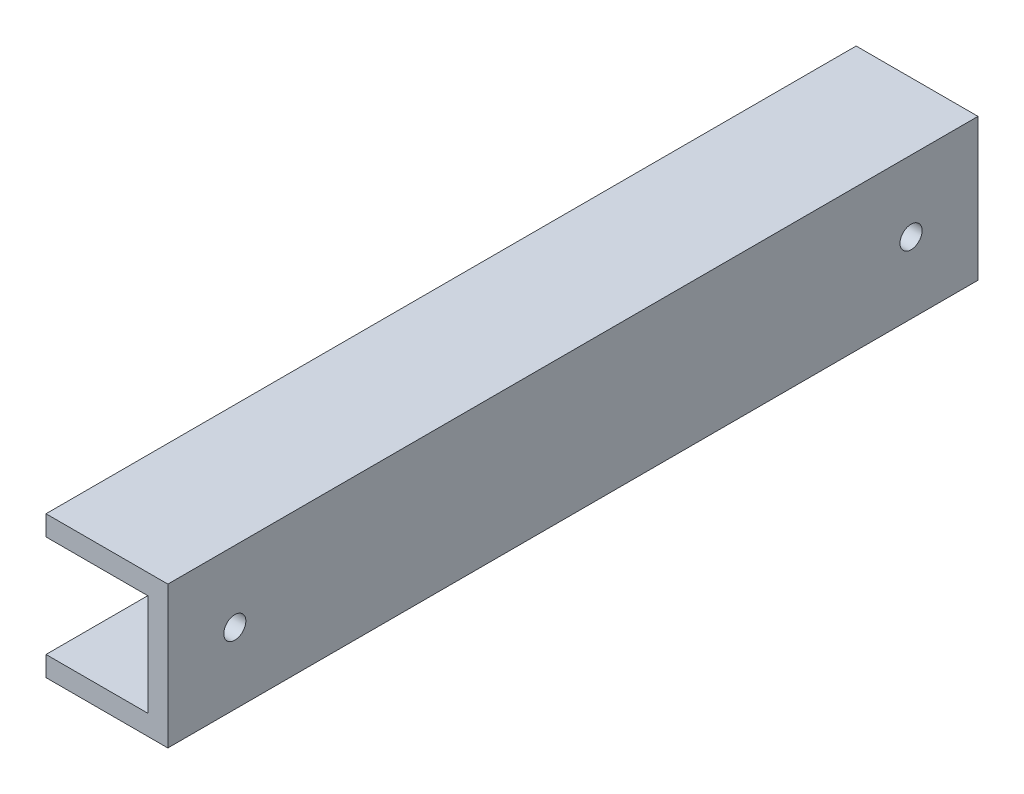
ISO-10303-21;
HEADER;
FILE_DESCRIPTION(('STEP AP214'),'2;1');
FILE_NAME('part.step','',(''),(''),'','','');
FILE_SCHEMA(('AUTOMOTIVE_DESIGN { 1 0 10303 214 1 1 1 1 }'));
ENDSEC;
DATA;
#1=APPLICATION_CONTEXT('core data for automotive mechanical design processes');
#2=APPLICATION_PROTOCOL_DEFINITION('international standard','automotive_design',2000,#1);
#3=PRODUCT_CONTEXT('',#1,'mechanical');
#4=PRODUCT('Part','Part','',(#3));
#5=PRODUCT_RELATED_PRODUCT_CATEGORY('part','',(#4));
#6=PRODUCT_DEFINITION_FORMATION('','',#4);
#7=PRODUCT_DEFINITION_CONTEXT('part definition',#1,'design');
#8=PRODUCT_DEFINITION('design','',#6,#7);
#9=PRODUCT_DEFINITION_SHAPE('','',#8);
#10=(LENGTH_UNIT() NAMED_UNIT(*) SI_UNIT(.MILLI.,.METRE.));
#11=(NAMED_UNIT(*) PLANE_ANGLE_UNIT() SI_UNIT($,.RADIAN.));
#12=(NAMED_UNIT(*) SI_UNIT($,.STERADIAN.) SOLID_ANGLE_UNIT());
#13=UNCERTAINTY_MEASURE_WITH_UNIT(LENGTH_MEASURE(1.E-05),#10,'distance_accuracy_value','');
#14=(GEOMETRIC_REPRESENTATION_CONTEXT(3) GLOBAL_UNCERTAINTY_ASSIGNED_CONTEXT((#13)) GLOBAL_UNIT_ASSIGNED_CONTEXT((#10,
#11,#12)) REPRESENTATION_CONTEXT('',''));
#15=CARTESIAN_POINT('',(0.,0.,0.));
#16=DIRECTION('',(0.,0.,1.));
#17=DIRECTION('',(1.,0.,0.));
#18=AXIS2_PLACEMENT_3D('',#15,#16,#17);
#19=CARTESIAN_POINT('',(5.2,15.2,25.));
#20=DIRECTION('',(0.,0.,1.));
#21=DIRECTION('',(0.,-1.,0.));
#22=AXIS2_PLACEMENT_3D('',#19,#20,#21);
#23=PLANE('',#22);
#24=DIRECTION('',(1.,0.,0.));
#25=VECTOR('',#24,1.);
#26=CARTESIAN_POINT('',(5.2,15.2,25.));
#27=LINE('',#26,#25);
#28=CARTESIAN_POINT('',(5.2,15.2,25.));
#29=VERTEX_POINT('',#28);
#30=CARTESIAN_POINT('',(11.2,15.2,25.));
#31=VERTEX_POINT('',#30);
#32=EDGE_CURVE('E237',#29,#31,#27,.T.);
#33=ORIENTED_EDGE('',*,*,#32,.T.);
#34=DIRECTION('',(0.,-1.,0.));
#35=VECTOR('',#34,1.);
#36=CARTESIAN_POINT('',(11.2,15.2,25.));
#37=LINE('',#36,#35);
#38=CARTESIAN_POINT('',(11.2,10.1,25.));
#39=VERTEX_POINT('',#38);
#40=EDGE_CURVE('E71',#31,#39,#37,.T.);
#41=ORIENTED_EDGE('',*,*,#40,.T.);
#42=DIRECTION('',(-1.,0.,0.));
#43=VECTOR('',#42,1.);
#44=CARTESIAN_POINT('',(8.2,10.1,25.));
#45=LINE('',#44,#43);
#46=CARTESIAN_POINT('',(5.2,10.1,25.));
#47=VERTEX_POINT('',#46);
#48=EDGE_CURVE('E352',#39,#47,#45,.T.);
#49=ORIENTED_EDGE('',*,*,#48,.T.);
#50=DIRECTION('',(0.,-1.,0.));
#51=VECTOR('',#50,1.);
#52=CARTESIAN_POINT('',(5.2,15.2,25.));
#53=LINE('',#52,#51);
#54=EDGE_CURVE('E223',#29,#47,#53,.T.);
#55=ORIENTED_EDGE('',*,*,#54,.F.);
#56=EDGE_LOOP('',(#33,#41,#49,#55));
#57=FACE_BOUND('',#56,.T.);
#58=ADVANCED_FACE('F62',(#57),#23,.F.);
#59=CARTESIAN_POINT('',(5.2,15.2,96.));
#60=DIRECTION('',(0.,0.,-1.));
#61=DIRECTION('',(-1.,0.,0.));
#62=AXIS2_PLACEMENT_3D('',#59,#60,#61);
#63=PLANE('',#62);
#64=DIRECTION('',(1.,0.,0.));
#65=VECTOR('',#64,1.);
#66=CARTESIAN_POINT('',(5.2,0.,96.));
#67=LINE('',#66,#65);
#68=CARTESIAN_POINT('',(5.2,0.,96.));
#69=VERTEX_POINT('',#68);
#70=CARTESIAN_POINT('',(11.2,0.,96.));
#71=VERTEX_POINT('',#70);
#72=EDGE_CURVE('E224',#69,#71,#67,.T.);
#73=ORIENTED_EDGE('',*,*,#72,.T.);
#74=DIRECTION('',(0.,1.,0.));
#75=VECTOR('',#74,1.);
#76=CARTESIAN_POINT('',(11.2,15.2,96.));
#77=LINE('',#76,#75);
#78=CARTESIAN_POINT('',(11.2,5.1,96.));
#79=VERTEX_POINT('',#78);
#80=EDGE_CURVE('E334',#71,#79,#77,.T.);
#81=ORIENTED_EDGE('',*,*,#80,.T.);
#82=DIRECTION('',(-1.,0.,0.));
#83=VECTOR('',#82,1.);
#84=CARTESIAN_POINT('',(8.2,5.1,96.));
#85=LINE('',#84,#83);
#86=CARTESIAN_POINT('',(5.2,5.1,96.));
#87=VERTEX_POINT('',#86);
#88=EDGE_CURVE('E209',#79,#87,#85,.T.);
#89=ORIENTED_EDGE('',*,*,#88,.T.);
#90=DIRECTION('',(0.,1.,0.));
#91=VECTOR('',#90,1.);
#92=CARTESIAN_POINT('',(5.2,15.2,96.));
#93=LINE('',#92,#91);
#94=EDGE_CURVE('E218',#69,#87,#93,.T.);
#95=ORIENTED_EDGE('',*,*,#94,.F.);
#96=EDGE_LOOP('',(#73,#81,#89,#95));
#97=FACE_BOUND('',#96,.T.);
#98=ADVANCED_FACE('F424',(#97),#63,.F.);
#99=CARTESIAN_POINT('',(5.2,0.,0.));
#100=DIRECTION('',(-1.,0.,0.));
#101=DIRECTION('',(0.,0.,1.));
#102=AXIS2_PLACEMENT_3D('',#99,#100,#101);
#103=PLANE('',#102);
#104=DIRECTION('',(0.,0.,-1.));
#105=VECTOR('',#104,1.);
#106=CARTESIAN_POINT('',(5.2,10.1,25.));
#107=LINE('',#106,#105);
#108=CARTESIAN_POINT('',(5.2,10.1,96.));
#109=VERTEX_POINT('',#108);
#110=EDGE_CURVE('E219',#109,#47,#107,.T.);
#111=ORIENTED_EDGE('',*,*,#110,.F.);
#112=CARTESIAN_POINT('',(5.2,15.2,96.));
#113=VERTEX_POINT('',#112);
#114=EDGE_CURVE('E361',#109,#113,#93,.T.);
#115=ORIENTED_EDGE('',*,*,#114,.T.);
#116=DIRECTION('',(0.,0.,-1.));
#117=VECTOR('',#116,1.);
#118=CARTESIAN_POINT('',(5.2,15.2,25.));
#119=LINE('',#118,#117);
#120=EDGE_CURVE('E234',#113,#29,#119,.T.);
#121=ORIENTED_EDGE('',*,*,#120,.T.);
#122=ORIENTED_EDGE('',*,*,#54,.T.);
#123=EDGE_LOOP('',(#111,#115,#121,#122));
#124=FACE_BOUND('',#123,.T.);
#125=ADVANCED_FACE('F429',(#124),#103,.T.);
#126=CARTESIAN_POINT('',(0.,0.,121.));
#127=DIRECTION('',(0.,1.,0.));
#128=DIRECTION('',(0.,0.,1.));
#129=AXIS2_PLACEMENT_3D('',#126,#127,#128);
#130=PLANE('',#129);
#131=DIRECTION('',(0.,0.,-1.));
#132=VECTOR('',#131,1.);
#133=CARTESIAN_POINT('',(15.2,0.,121.));
#134=LINE('',#133,#132);
#135=CARTESIAN_POINT('',(15.2,0.,121.));
#136=VERTEX_POINT('',#135);
#137=CARTESIAN_POINT('',(15.2,0.,100.));
#138=VERTEX_POINT('',#137);
#139=EDGE_CURVE('E285',#136,#138,#134,.T.);
#140=ORIENTED_EDGE('',*,*,#139,.T.);
#141=DIRECTION('',(-0.707106781186551,0.,-0.707106781186544));
#142=VECTOR('',#141,1.);
#143=CARTESIAN_POINT('',(18.0999999999999,0.,102.9));
#144=LINE('',#143,#142);
#145=EDGE_CURVE('E344',#138,#71,#144,.T.);
#146=ORIENTED_EDGE('',*,*,#145,.T.);
#147=ORIENTED_EDGE('',*,*,#72,.F.);
#148=DIRECTION('',(0.,0.,1.));
#149=VECTOR('',#148,1.);
#150=CARTESIAN_POINT('',(5.2,0.,25.));
#151=LINE('',#150,#149);
#152=CARTESIAN_POINT('',(5.2,0.,25.));
#153=VERTEX_POINT('',#152);
#154=EDGE_CURVE('E227',#153,#69,#151,.T.);
#155=ORIENTED_EDGE('',*,*,#154,.F.);
#156=DIRECTION('',(1.,0.,0.));
#157=VECTOR('',#156,1.);
#158=CARTESIAN_POINT('',(5.2,0.,25.));
#159=LINE('',#158,#157);
#160=CARTESIAN_POINT('',(11.2,0.,25.));
#161=VERTEX_POINT('',#160);
#162=EDGE_CURVE('E222',#153,#161,#159,.T.);
#163=ORIENTED_EDGE('',*,*,#162,.T.);
#164=DIRECTION('',(0.707106781186551,0.,-0.707106781186544));
#165=VECTOR('',#164,1.);
#166=CARTESIAN_POINT('',(-42.4000000000001,0.,78.5999999999996));
#167=LINE('',#166,#165);
#168=CARTESIAN_POINT('',(15.2,0.,21.));
#169=VERTEX_POINT('',#168);
#170=EDGE_CURVE('E78',#161,#169,#167,.T.);
#171=ORIENTED_EDGE('',*,*,#170,.T.);
#172=CARTESIAN_POINT('',(15.2,0.,0.));
#173=VERTEX_POINT('',#172);
#174=EDGE_CURVE('E284',#169,#173,#134,.T.);
#175=ORIENTED_EDGE('',*,*,#174,.T.);
#176=DIRECTION('',(1.,0.,0.));
#177=VECTOR('',#176,1.);
#178=CARTESIAN_POINT('',(0.,0.,0.));
#179=LINE('',#178,#177);
#180=CARTESIAN_POINT('',(0.,0.,0.));
#181=VERTEX_POINT('',#180);
#182=EDGE_CURVE('E260',#181,#173,#179,.T.);
#183=ORIENTED_EDGE('',*,*,#182,.F.);
#184=DIRECTION('',(0.,0.,-1.));
#185=VECTOR('',#184,1.);
#186=CARTESIAN_POINT('',(0.,0.,121.));
#187=LINE('',#186,#185);
#188=CARTESIAN_POINT('',(0.,0.,121.));
#189=VERTEX_POINT('',#188);
#190=EDGE_CURVE('E288',#189,#181,#187,.T.);
#191=ORIENTED_EDGE('',*,*,#190,.F.);
#192=DIRECTION('',(1.,0.,0.));
#193=VECTOR('',#192,1.);
#194=CARTESIAN_POINT('',(0.,0.,121.));
#195=LINE('',#194,#193);
#196=EDGE_CURVE('E261',#189,#136,#195,.T.);
#197=ORIENTED_EDGE('',*,*,#196,.T.);
#198=EDGE_LOOP('',(#140,#146,#147,#155,#163,#171,#175,#183,#191,#197));
#199=FACE_BOUND('',#198,.T.);
#200=ADVANCED_FACE('F397',(#199),#130,.T.);
#201=CARTESIAN_POINT('',(15.2,0.,121.));
#202=DIRECTION('',(-1.,0.,0.));
#203=DIRECTION('',(0.,0.,1.));
#204=AXIS2_PLACEMENT_3D('',#201,#202,#203);
#205=PLANE('',#204);
#206=CARTESIAN_POINT('',(15.2,7.6,111.));
#207=DIRECTION('',(-1.,0.,0.));
#208=DIRECTION('',(0.,0.,1.));
#209=AXIS2_PLACEMENT_3D('',#206,#207,#208);
#210=CIRCLE('',#209,1.64999999999999);
#211=CARTESIAN_POINT('',(15.2,7.6,112.65));
#212=VERTEX_POINT('',#211);
#213=EDGE_CURVE('E248',#212,#212,#210,.T.);
#214=ORIENTED_EDGE('',*,*,#213,.F.);
#215=EDGE_LOOP('',(#214));
#216=FACE_BOUND('',#215,.T.);
#217=DIRECTION('',(0.,0.,-1.));
#218=VECTOR('',#217,1.);
#219=CARTESIAN_POINT('',(15.2,15.2,121.));
#220=LINE('',#219,#218);
#221=CARTESIAN_POINT('',(15.2,15.2,121.));
#222=VERTEX_POINT('',#221);
#223=CARTESIAN_POINT('',(15.2,15.2,100.));
#224=VERTEX_POINT('',#223);
#225=EDGE_CURVE('E281',#222,#224,#220,.T.);
#226=ORIENTED_EDGE('',*,*,#225,.T.);
#227=DIRECTION('',(0.,-1.,0.));
#228=VECTOR('',#227,1.);
#229=CARTESIAN_POINT('',(15.2,0.,100.));
#230=LINE('',#229,#228);
#231=EDGE_CURVE('E341',#224,#138,#230,.T.);
#232=ORIENTED_EDGE('',*,*,#231,.T.);
#233=ORIENTED_EDGE('',*,*,#139,.F.);
#234=DIRECTION('',(0.,1.,0.));
#235=VECTOR('',#234,1.);
#236=CARTESIAN_POINT('',(15.2,0.,121.));
#237=LINE('',#236,#235);
#238=EDGE_CURVE('E263',#136,#222,#237,.T.);
#239=ORIENTED_EDGE('',*,*,#238,.T.);
#240=EDGE_LOOP('',(#226,#232,#233,#239));
#241=FACE_BOUND('',#240,.T.);
#242=ADVANCED_FACE('F395',(#216,#241),#205,.T.);
#243=CARTESIAN_POINT('',(0.,15.2,121.));
#244=DIRECTION('',(0.,-1.,0.));
#245=DIRECTION('',(0.,0.,-1.));
#246=AXIS2_PLACEMENT_3D('',#243,#244,#245);
#247=PLANE('',#246);
#248=DIRECTION('',(1.,0.,0.));
#249=VECTOR('',#248,1.);
#250=CARTESIAN_POINT('',(5.2,15.2,96.));
#251=LINE('',#250,#249);
#252=CARTESIAN_POINT('',(11.2,15.2,96.));
#253=VERTEX_POINT('',#252);
#254=EDGE_CURVE('E229',#113,#253,#251,.T.);
#255=ORIENTED_EDGE('',*,*,#254,.T.);
#256=DIRECTION('',(0.707106781186551,0.,0.707106781186544));
#257=VECTOR('',#256,1.);
#258=CARTESIAN_POINT('',(18.0999999999999,15.2,102.9));
#259=LINE('',#258,#257);
#260=EDGE_CURVE('E339',#253,#224,#259,.T.);
#261=ORIENTED_EDGE('',*,*,#260,.T.);
#262=ORIENTED_EDGE('',*,*,#225,.F.);
#263=DIRECTION('',(-1.,0.,0.));
#264=VECTOR('',#263,1.);
#265=CARTESIAN_POINT('',(0.,15.2,121.));
#266=LINE('',#265,#264);
#267=CARTESIAN_POINT('',(0.,15.2,121.));
#268=VERTEX_POINT('',#267);
#269=EDGE_CURVE('E267',#222,#268,#266,.T.);
#270=ORIENTED_EDGE('',*,*,#269,.T.);
#271=DIRECTION('',(0.,0.,-1.));
#272=VECTOR('',#271,1.);
#273=CARTESIAN_POINT('',(0.,15.2,121.));
#274=LINE('',#273,#272);
#275=CARTESIAN_POINT('',(0.,15.2,0.));
#276=VERTEX_POINT('',#275);
#277=EDGE_CURVE('E270',#268,#276,#274,.T.);
#278=ORIENTED_EDGE('',*,*,#277,.T.);
#279=DIRECTION('',(-1.,0.,0.));
#280=VECTOR('',#279,1.);
#281=CARTESIAN_POINT('',(0.,15.2,0.));
#282=LINE('',#281,#280);
#283=CARTESIAN_POINT('',(15.2,15.2,0.));
#284=VERTEX_POINT('',#283);
#285=EDGE_CURVE('E264',#284,#276,#282,.T.);
#286=ORIENTED_EDGE('',*,*,#285,.F.);
#287=CARTESIAN_POINT('',(15.2,15.2,21.));
#288=VERTEX_POINT('',#287);
#289=EDGE_CURVE('E280',#288,#284,#220,.T.);
#290=ORIENTED_EDGE('',*,*,#289,.F.);
#291=DIRECTION('',(-0.707106781186551,0.,0.707106781186544));
#292=VECTOR('',#291,1.);
#293=CARTESIAN_POINT('',(-42.4,15.2,78.5999999999996));
#294=LINE('',#293,#292);
#295=EDGE_CURVE('E337',#288,#31,#294,.T.);
#296=ORIENTED_EDGE('',*,*,#295,.T.);
#297=ORIENTED_EDGE('',*,*,#32,.F.);
#298=ORIENTED_EDGE('',*,*,#120,.F.);
#299=EDGE_LOOP('',(#255,#261,#262,#270,#278,#286,#290,#296,#297,#298));
#300=FACE_BOUND('',#299,.T.);
#301=ADVANCED_FACE('F384',(#300),#247,.T.);
#302=CARTESIAN_POINT('',(15.2,7.6,10.));
#303=DIRECTION('',(-1.,0.,0.));
#304=DIRECTION('',(0.,0.,1.));
#305=AXIS2_PLACEMENT_3D('',#302,#303,#304);
#306=CIRCLE('',#305,1.65);
#307=CARTESIAN_POINT('',(15.2,7.6,11.65));
#308=VERTEX_POINT('',#307);
#309=EDGE_CURVE('E256',#308,#308,#306,.T.);
#310=ORIENTED_EDGE('',*,*,#309,.F.);
#311=EDGE_LOOP('',(#310));
#312=FACE_BOUND('',#311,.T.);
#313=ORIENTED_EDGE('',*,*,#174,.F.);
#314=DIRECTION('',(0.,1.,0.));
#315=VECTOR('',#314,1.);
#316=CARTESIAN_POINT('',(15.2,1.3695185336659E-13,21.));
#317=LINE('',#316,#315);
#318=EDGE_CURVE('E12',#169,#288,#317,.T.);
#319=ORIENTED_EDGE('',*,*,#318,.T.);
#320=ORIENTED_EDGE('',*,*,#289,.T.);
#321=DIRECTION('',(0.,1.,0.));
#322=VECTOR('',#321,1.);
#323=CARTESIAN_POINT('',(15.2,0.,0.));
#324=LINE('',#323,#322);
#325=EDGE_CURVE('E273',#173,#284,#324,.T.);
#326=ORIENTED_EDGE('',*,*,#325,.F.);
#327=EDGE_LOOP('',(#313,#319,#320,#326));
#328=FACE_BOUND('',#327,.T.);
#329=ADVANCED_FACE('F417',(#312,#328),#205,.T.);
#330=CARTESIAN_POINT('',(0.,0.,121.));
#331=DIRECTION('',(0.,0.,1.));
#332=DIRECTION('',(1.,0.,0.));
#333=AXIS2_PLACEMENT_3D('',#330,#331,#332);
#334=PLANE('',#333);
#335=DIRECTION('',(-1.,0.,0.));
#336=VECTOR('',#335,1.);
#337=CARTESIAN_POINT('',(0.,18.2,121.));
#338=LINE('',#337,#336);
#339=CARTESIAN_POINT('',(18.2,18.2,121.));
#340=VERTEX_POINT('',#339);
#341=CARTESIAN_POINT('',(0.,18.2,121.));
#342=VERTEX_POINT('',#341);
#343=EDGE_CURVE('E296',#340,#342,#338,.T.);
#344=ORIENTED_EDGE('',*,*,#343,.T.);
#345=DIRECTION('',(0.,-1.,0.));
#346=VECTOR('',#345,1.);
#347=CARTESIAN_POINT('',(0.,0.,121.));
#348=LINE('',#347,#346);
#349=EDGE_CURVE('E244',#342,#268,#348,.T.);
#350=ORIENTED_EDGE('',*,*,#349,.T.);
#351=ORIENTED_EDGE('',*,*,#269,.F.);
#352=ORIENTED_EDGE('',*,*,#238,.F.);
#353=ORIENTED_EDGE('',*,*,#196,.F.);
#354=CARTESIAN_POINT('',(0.,-3.,121.));
#355=VERTEX_POINT('',#354);
#356=EDGE_CURVE('E249',#189,#355,#348,.T.);
#357=ORIENTED_EDGE('',*,*,#356,.T.);
#358=DIRECTION('',(1.,0.,0.));
#359=VECTOR('',#358,1.);
#360=CARTESIAN_POINT('',(0.,-3.,121.));
#361=LINE('',#360,#359);
#362=CARTESIAN_POINT('',(18.2,-3.,121.));
#363=VERTEX_POINT('',#362);
#364=EDGE_CURVE('E291',#355,#363,#361,.T.);
#365=ORIENTED_EDGE('',*,*,#364,.T.);
#366=DIRECTION('',(0.,1.,0.));
#367=VECTOR('',#366,1.);
#368=CARTESIAN_POINT('',(18.2,0.,121.));
#369=LINE('',#368,#367);
#370=EDGE_CURVE('E293',#363,#340,#369,.T.);
#371=ORIENTED_EDGE('',*,*,#370,.T.);
#372=EDGE_LOOP('',(#344,#350,#351,#352,#353,#357,#365,#371));
#373=FACE_BOUND('',#372,.T.);
#374=ADVANCED_FACE('F404',(#373),#334,.T.);
#375=CARTESIAN_POINT('',(0.,0.,0.));
#376=DIRECTION('',(0.,0.,1.));
#377=DIRECTION('',(1.,0.,0.));
#378=AXIS2_PLACEMENT_3D('',#375,#376,#377);
#379=PLANE('',#378);
#380=DIRECTION('',(0.,-1.,0.));
#381=VECTOR('',#380,1.);
#382=CARTESIAN_POINT('',(0.,0.,0.));
#383=LINE('',#382,#381);
#384=CARTESIAN_POINT('',(0.,18.2,0.));
#385=VERTEX_POINT('',#384);
#386=EDGE_CURVE('E242',#385,#276,#383,.T.);
#387=ORIENTED_EDGE('',*,*,#386,.F.);
#388=DIRECTION('',(-1.,0.,0.));
#389=VECTOR('',#388,1.);
#390=CARTESIAN_POINT('',(0.,18.2,0.));
#391=LINE('',#390,#389);
#392=CARTESIAN_POINT('',(18.2,18.2,0.));
#393=VERTEX_POINT('',#392);
#394=EDGE_CURVE('E294',#393,#385,#391,.T.);
#395=ORIENTED_EDGE('',*,*,#394,.F.);
#396=DIRECTION('',(0.,1.,0.));
#397=VECTOR('',#396,1.);
#398=CARTESIAN_POINT('',(18.2,0.,0.));
#399=LINE('',#398,#397);
#400=CARTESIAN_POINT('',(18.2,-3.,0.));
#401=VERTEX_POINT('',#400);
#402=EDGE_CURVE('E301',#401,#393,#399,.T.);
#403=ORIENTED_EDGE('',*,*,#402,.F.);
#404=DIRECTION('',(1.,0.,0.));
#405=VECTOR('',#404,1.);
#406=CARTESIAN_POINT('',(0.,-3.,0.));
#407=LINE('',#406,#405);
#408=CARTESIAN_POINT('',(0.,-3.,0.));
#409=VERTEX_POINT('',#408);
#410=EDGE_CURVE('E290',#409,#401,#407,.T.);
#411=ORIENTED_EDGE('',*,*,#410,.F.);
#412=EDGE_CURVE('E241',#181,#409,#383,.T.);
#413=ORIENTED_EDGE('',*,*,#412,.F.);
#414=ORIENTED_EDGE('',*,*,#182,.T.);
#415=ORIENTED_EDGE('',*,*,#325,.T.);
#416=ORIENTED_EDGE('',*,*,#285,.T.);
#417=EDGE_LOOP('',(#387,#395,#403,#411,#413,#414,#415,#416));
#418=FACE_BOUND('',#417,.T.);
#419=ADVANCED_FACE('F412',(#418),#379,.F.);
#420=CARTESIAN_POINT('',(0.,-3.,121.));
#421=DIRECTION('',(0.,1.,0.));
#422=DIRECTION('',(0.,0.,1.));
#423=AXIS2_PLACEMENT_3D('',#420,#421,#422);
#424=PLANE('',#423);
#425=DIRECTION('',(0.,0.,1.));
#426=VECTOR('',#425,1.);
#427=CARTESIAN_POINT('',(0.,-3.,121.));
#428=LINE('',#427,#426);
#429=EDGE_CURVE('E250',#409,#355,#428,.T.);
#430=ORIENTED_EDGE('',*,*,#429,.F.);
#431=ORIENTED_EDGE('',*,*,#410,.T.);
#432=DIRECTION('',(0.,0.,-1.));
#433=VECTOR('',#432,1.);
#434=CARTESIAN_POINT('',(18.2,-3.,121.));
#435=LINE('',#434,#433);
#436=EDGE_CURVE('E307',#363,#401,#435,.T.);
#437=ORIENTED_EDGE('',*,*,#436,.F.);
#438=ORIENTED_EDGE('',*,*,#364,.F.);
#439=EDGE_LOOP('',(#430,#431,#437,#438));
#440=FACE_BOUND('',#439,.T.);
#441=ADVANCED_FACE('F467',(#440),#424,.F.);
#442=CARTESIAN_POINT('',(0.,18.2,121.));
#443=DIRECTION('',(0.,-1.,0.));
#444=DIRECTION('',(0.,0.,-1.));
#445=AXIS2_PLACEMENT_3D('',#442,#443,#444);
#446=PLANE('',#445);
#447=DIRECTION('',(0.,0.,-1.));
#448=VECTOR('',#447,1.);
#449=CARTESIAN_POINT('',(0.,18.2,121.));
#450=LINE('',#449,#448);
#451=EDGE_CURVE('E245',#342,#385,#450,.T.);
#452=ORIENTED_EDGE('',*,*,#451,.F.);
#453=ORIENTED_EDGE('',*,*,#343,.F.);
#454=DIRECTION('',(0.,0.,-1.));
#455=VECTOR('',#454,1.);
#456=CARTESIAN_POINT('',(18.2,18.2,121.));
#457=LINE('',#456,#455);
#458=EDGE_CURVE('E299',#340,#393,#457,.T.);
#459=ORIENTED_EDGE('',*,*,#458,.T.);
#460=ORIENTED_EDGE('',*,*,#394,.T.);
#461=EDGE_LOOP('',(#452,#453,#459,#460));
#462=FACE_BOUND('',#461,.T.);
#463=ADVANCED_FACE('F468',(#462),#446,.F.);
#464=CARTESIAN_POINT('',(18.2,0.,121.));
#465=DIRECTION('',(-1.,0.,0.));
#466=DIRECTION('',(0.,0.,1.));
#467=AXIS2_PLACEMENT_3D('',#464,#465,#466);
#468=PLANE('',#467);
#469=CARTESIAN_POINT('',(18.2,7.6,10.));
#470=DIRECTION('',(-1.,0.,0.));
#471=DIRECTION('',(0.,0.,1.));
#472=AXIS2_PLACEMENT_3D('',#469,#470,#471);
#473=CIRCLE('',#472,1.65);
#474=CARTESIAN_POINT('',(18.2,7.6,11.65));
#475=VERTEX_POINT('',#474);
#476=EDGE_CURVE('E257',#475,#475,#473,.T.);
#477=ORIENTED_EDGE('',*,*,#476,.T.);
#478=EDGE_LOOP('',(#477));
#479=FACE_BOUND('',#478,.T.);
#480=CARTESIAN_POINT('',(18.2,7.6,111.));
#481=DIRECTION('',(-1.,0.,0.));
#482=DIRECTION('',(0.,0.,1.));
#483=AXIS2_PLACEMENT_3D('',#480,#481,#482);
#484=CIRCLE('',#483,1.64999999999999);
#485=CARTESIAN_POINT('',(18.2,7.6,112.65));
#486=VERTEX_POINT('',#485);
#487=EDGE_CURVE('E253',#486,#486,#484,.T.);
#488=ORIENTED_EDGE('',*,*,#487,.T.);
#489=EDGE_LOOP('',(#488));
#490=FACE_BOUND('',#489,.T.);
#491=ORIENTED_EDGE('',*,*,#402,.T.);
#492=ORIENTED_EDGE('',*,*,#458,.F.);
#493=ORIENTED_EDGE('',*,*,#370,.F.);
#494=ORIENTED_EDGE('',*,*,#436,.T.);
#495=EDGE_LOOP('',(#491,#492,#493,#494));
#496=FACE_BOUND('',#495,.T.);
#497=ADVANCED_FACE('F454',(#479,#490,#496),#468,.F.);
#498=CARTESIAN_POINT('',(27.,7.6,111.));
#499=DIRECTION('',(-1.,0.,0.));
#500=DIRECTION('',(0.,0.,1.));
#501=AXIS2_PLACEMENT_3D('',#498,#499,#500);
#502=CYLINDRICAL_SURFACE('',#501,1.64999999999999);
#503=CARTESIAN_POINT('',(15.2,7.6,112.65));
#504=CARTESIAN_POINT('',(15.23125,7.6,112.65));
#505=CARTESIAN_POINT('',(15.2625,7.6,112.65));
#506=CARTESIAN_POINT('',(15.325,7.6,112.65));
#507=CARTESIAN_POINT('',(15.35625,7.6,112.65));
#508=CARTESIAN_POINT('',(15.41875,7.6,112.65));
#509=CARTESIAN_POINT('',(15.45,7.6,112.65));
#510=CARTESIAN_POINT('',(15.5125,7.6,112.65));
#511=CARTESIAN_POINT('',(15.54375,7.6,112.65));
#512=CARTESIAN_POINT('',(15.60625,7.6,112.65));
#513=CARTESIAN_POINT('',(15.6375,7.6,112.65));
#514=CARTESIAN_POINT('',(15.7,7.6,112.65));
#515=CARTESIAN_POINT('',(15.73125,7.6,112.65));
#516=CARTESIAN_POINT('',(15.79375,7.6,112.65));
#517=CARTESIAN_POINT('',(15.825,7.6,112.65));
#518=CARTESIAN_POINT('',(15.8875,7.6,112.65));
#519=CARTESIAN_POINT('',(15.91875,7.6,112.65));
#520=CARTESIAN_POINT('',(15.98125,7.6,112.65));
#521=CARTESIAN_POINT('',(16.0125,7.6,112.65));
#522=CARTESIAN_POINT('',(16.075,7.6,112.65));
#523=CARTESIAN_POINT('',(16.10625,7.6,112.65));
#524=CARTESIAN_POINT('',(16.16875,7.6,112.65));
#525=CARTESIAN_POINT('',(16.2,7.6,112.65));
#526=CARTESIAN_POINT('',(16.2625,7.6,112.65));
#527=CARTESIAN_POINT('',(16.29375,7.6,112.65));
#528=CARTESIAN_POINT('',(16.35625,7.6,112.65));
#529=CARTESIAN_POINT('',(16.3875,7.6,112.65));
#530=CARTESIAN_POINT('',(16.45,7.6,112.65));
#531=CARTESIAN_POINT('',(16.48125,7.6,112.65));
#532=CARTESIAN_POINT('',(16.54375,7.6,112.65));
#533=CARTESIAN_POINT('',(16.575,7.6,112.65));
#534=CARTESIAN_POINT('',(16.6375,7.6,112.65));
#535=CARTESIAN_POINT('',(16.66875,7.6,112.65));
#536=CARTESIAN_POINT('',(16.73125,7.6,112.65));
#537=CARTESIAN_POINT('',(16.7625,7.6,112.65));
#538=CARTESIAN_POINT('',(16.825,7.6,112.65));
#539=CARTESIAN_POINT('',(16.85625,7.6,112.65));
#540=CARTESIAN_POINT('',(16.91875,7.6,112.65));
#541=CARTESIAN_POINT('',(16.95,7.6,112.65));
#542=CARTESIAN_POINT('',(17.0125,7.6,112.65));
#543=CARTESIAN_POINT('',(17.04375,7.6,112.65));
#544=CARTESIAN_POINT('',(17.10625,7.6,112.65));
#545=CARTESIAN_POINT('',(17.1375,7.6,112.65));
#546=CARTESIAN_POINT('',(17.2,7.6,112.65));
#547=CARTESIAN_POINT('',(17.23125,7.6,112.65));
#548=CARTESIAN_POINT('',(17.29375,7.6,112.65));
#549=CARTESIAN_POINT('',(17.325,7.6,112.65));
#550=CARTESIAN_POINT('',(17.3875,7.6,112.65));
#551=CARTESIAN_POINT('',(17.41875,7.6,112.65));
#552=CARTESIAN_POINT('',(17.48125,7.6,112.65));
#553=CARTESIAN_POINT('',(17.5125,7.6,112.65));
#554=CARTESIAN_POINT('',(17.575,7.6,112.65));
#555=CARTESIAN_POINT('',(17.60625,7.6,112.65));
#556=CARTESIAN_POINT('',(17.66875,7.6,112.65));
#557=CARTESIAN_POINT('',(17.7,7.6,112.65));
#558=CARTESIAN_POINT('',(17.7625,7.6,112.65));
#559=CARTESIAN_POINT('',(17.79375,7.6,112.65));
#560=CARTESIAN_POINT('',(17.85625,7.6,112.65));
#561=CARTESIAN_POINT('',(17.8875,7.6,112.65));
#562=CARTESIAN_POINT('',(17.95,7.6,112.65));
#563=CARTESIAN_POINT('',(17.98125,7.6,112.65));
#564=CARTESIAN_POINT('',(18.04375,7.6,112.65));
#565=CARTESIAN_POINT('',(18.075,7.6,112.65));
#566=CARTESIAN_POINT('',(18.1375,7.6,112.65));
#567=CARTESIAN_POINT('',(18.16875,7.6,112.65));
#568=CARTESIAN_POINT('',(18.2,7.6,112.65));
#569=B_SPLINE_CURVE_WITH_KNOTS('',3,(#503,#504,#505,#506,#507,#508,#509,#510,#511,#512,#513,
#514,#515,#516,#517,#518,#519,#520,#521,#522,#523,#524,#525,#526,#527,#528,#529,#530,#531,#532,
#533,#534,#535,#536,#537,#538,#539,#540,#541,#542,#543,#544,#545,#546,#547,#548,#549,#550,#551,
#552,#553,#554,#555,#556,#557,#558,#559,#560,#561,#562,#563,#564,#565,#566,#567,#568),
.UNSPECIFIED.,.F.,.F.,(4,2,2,2,2,2,2,2,2,2,2,2,2,2,2,2,2,2,2,2,2,2,2,2,2,2,2,2,2,2,2,2,4),(0.,
0.0937500000000001,0.1875,0.28125,0.375,0.468750000000002,0.562499999999999,0.656250000000002,
0.749999999999999,0.843750000000002,0.937499999999999,1.03125,1.125,1.21875,1.3125,1.40625,1.5,
1.59375,1.6875,1.78125,1.875,1.96875,2.0625,2.15625,2.25,2.34375,2.4375,2.53125,2.625,2.71875,
2.8125,2.90625,3.),.UNSPECIFIED.);
#570=EDGE_CURVE('BSEAM450',#212,#486,#569,.T.);
#571=ORIENTED_EDGE('',*,*,#213,.T.);
#572=ORIENTED_EDGE('',*,*,#487,.F.);
#573=ORIENTED_EDGE('',*,*,#570,.T.);
#574=ORIENTED_EDGE('',*,*,#570,.F.);
#575=EDGE_LOOP('',(#571,#573,#572,#574));
#576=FACE_BOUND('',#575,.T.);
#577=ADVANCED_FACE('F450',(#576),#502,.F.);
#578=CARTESIAN_POINT('',(27.,7.6,10.));
#579=DIRECTION('',(-1.,0.,0.));
#580=DIRECTION('',(0.,0.,1.));
#581=AXIS2_PLACEMENT_3D('',#578,#579,#580);
#582=CYLINDRICAL_SURFACE('',#581,1.65);
#583=CARTESIAN_POINT('',(15.2,7.6,11.65));
#584=CARTESIAN_POINT('',(15.23125,7.6,11.65));
#585=CARTESIAN_POINT('',(15.2625,7.6,11.65));
#586=CARTESIAN_POINT('',(15.325,7.6,11.65));
#587=CARTESIAN_POINT('',(15.35625,7.6,11.65));
#588=CARTESIAN_POINT('',(15.41875,7.6,11.65));
#589=CARTESIAN_POINT('',(15.45,7.6,11.65));
#590=CARTESIAN_POINT('',(15.5125,7.6,11.65));
#591=CARTESIAN_POINT('',(15.54375,7.6,11.65));
#592=CARTESIAN_POINT('',(15.60625,7.6,11.65));
#593=CARTESIAN_POINT('',(15.6375,7.6,11.65));
#594=CARTESIAN_POINT('',(15.7,7.6,11.65));
#595=CARTESIAN_POINT('',(15.73125,7.6,11.65));
#596=CARTESIAN_POINT('',(15.79375,7.6,11.65));
#597=CARTESIAN_POINT('',(15.825,7.6,11.65));
#598=CARTESIAN_POINT('',(15.8875,7.6,11.65));
#599=CARTESIAN_POINT('',(15.91875,7.6,11.65));
#600=CARTESIAN_POINT('',(15.98125,7.6,11.65));
#601=CARTESIAN_POINT('',(16.0125,7.6,11.65));
#602=CARTESIAN_POINT('',(16.075,7.6,11.65));
#603=CARTESIAN_POINT('',(16.10625,7.6,11.65));
#604=CARTESIAN_POINT('',(16.16875,7.6,11.65));
#605=CARTESIAN_POINT('',(16.2,7.6,11.65));
#606=CARTESIAN_POINT('',(16.2625,7.6,11.65));
#607=CARTESIAN_POINT('',(16.29375,7.6,11.65));
#608=CARTESIAN_POINT('',(16.35625,7.6,11.65));
#609=CARTESIAN_POINT('',(16.3875,7.6,11.65));
#610=CARTESIAN_POINT('',(16.45,7.6,11.65));
#611=CARTESIAN_POINT('',(16.48125,7.6,11.65));
#612=CARTESIAN_POINT('',(16.54375,7.6,11.65));
#613=CARTESIAN_POINT('',(16.575,7.6,11.65));
#614=CARTESIAN_POINT('',(16.6375,7.6,11.65));
#615=CARTESIAN_POINT('',(16.66875,7.6,11.65));
#616=CARTESIAN_POINT('',(16.73125,7.6,11.65));
#617=CARTESIAN_POINT('',(16.7625,7.6,11.65));
#618=CARTESIAN_POINT('',(16.825,7.6,11.65));
#619=CARTESIAN_POINT('',(16.85625,7.6,11.65));
#620=CARTESIAN_POINT('',(16.91875,7.6,11.65));
#621=CARTESIAN_POINT('',(16.95,7.6,11.65));
#622=CARTESIAN_POINT('',(17.0125,7.6,11.65));
#623=CARTESIAN_POINT('',(17.04375,7.6,11.65));
#624=CARTESIAN_POINT('',(17.10625,7.6,11.65));
#625=CARTESIAN_POINT('',(17.1375,7.6,11.65));
#626=CARTESIAN_POINT('',(17.2,7.6,11.65));
#627=CARTESIAN_POINT('',(17.23125,7.6,11.65));
#628=CARTESIAN_POINT('',(17.29375,7.6,11.65));
#629=CARTESIAN_POINT('',(17.325,7.6,11.65));
#630=CARTESIAN_POINT('',(17.3875,7.6,11.65));
#631=CARTESIAN_POINT('',(17.41875,7.6,11.65));
#632=CARTESIAN_POINT('',(17.48125,7.6,11.65));
#633=CARTESIAN_POINT('',(17.5125,7.6,11.65));
#634=CARTESIAN_POINT('',(17.575,7.6,11.65));
#635=CARTESIAN_POINT('',(17.60625,7.6,11.65));
#636=CARTESIAN_POINT('',(17.66875,7.6,11.65));
#637=CARTESIAN_POINT('',(17.7,7.6,11.65));
#638=CARTESIAN_POINT('',(17.7625,7.6,11.65));
#639=CARTESIAN_POINT('',(17.79375,7.6,11.65));
#640=CARTESIAN_POINT('',(17.85625,7.6,11.65));
#641=CARTESIAN_POINT('',(17.8875,7.6,11.65));
#642=CARTESIAN_POINT('',(17.95,7.6,11.65));
#643=CARTESIAN_POINT('',(17.98125,7.6,11.65));
#644=CARTESIAN_POINT('',(18.04375,7.6,11.65));
#645=CARTESIAN_POINT('',(18.075,7.6,11.65));
#646=CARTESIAN_POINT('',(18.1375,7.6,11.65));
#647=CARTESIAN_POINT('',(18.16875,7.6,11.65));
#648=CARTESIAN_POINT('',(18.2,7.6,11.65));
#649=B_SPLINE_CURVE_WITH_KNOTS('',3,(#583,#584,#585,#586,#587,#588,#589,#590,#591,#592,#593,
#594,#595,#596,#597,#598,#599,#600,#601,#602,#603,#604,#605,#606,#607,#608,#609,#610,#611,#612,
#613,#614,#615,#616,#617,#618,#619,#620,#621,#622,#623,#624,#625,#626,#627,#628,#629,#630,#631,
#632,#633,#634,#635,#636,#637,#638,#639,#640,#641,#642,#643,#644,#645,#646,#647,#648),
.UNSPECIFIED.,.F.,.F.,(4,2,2,2,2,2,2,2,2,2,2,2,2,2,2,2,2,2,2,2,2,2,2,2,2,2,2,2,2,2,2,2,4),(0.,
0.0937500000000001,0.1875,0.28125,0.375,0.468750000000002,0.562499999999999,0.656250000000002,
0.749999999999999,0.843750000000002,0.937499999999999,1.03125,1.125,1.21875,1.3125,1.40625,1.5,
1.59375,1.6875,1.78125,1.875,1.96875,2.0625,2.15625,2.25,2.34375,2.4375,2.53125,2.625,2.71875,
2.8125,2.90625,3.),.UNSPECIFIED.);
#650=EDGE_CURVE('BSEAM446',#308,#475,#649,.T.);
#651=ORIENTED_EDGE('',*,*,#309,.T.);
#652=ORIENTED_EDGE('',*,*,#476,.F.);
#653=ORIENTED_EDGE('',*,*,#650,.T.);
#654=ORIENTED_EDGE('',*,*,#650,.F.);
#655=EDGE_LOOP('',(#651,#653,#652,#654));
#656=FACE_BOUND('',#655,.T.);
#657=ADVANCED_FACE('F446',(#656),#582,.F.);
#658=CARTESIAN_POINT('',(0.,0.,0.));
#659=DIRECTION('',(-1.,0.,0.));
#660=DIRECTION('',(0.,0.,1.));
#661=AXIS2_PLACEMENT_3D('',#658,#659,#660);
#662=PLANE('',#661);
#663=ORIENTED_EDGE('',*,*,#451,.T.);
#664=ORIENTED_EDGE('',*,*,#386,.T.);
#665=ORIENTED_EDGE('',*,*,#277,.F.);
#666=ORIENTED_EDGE('',*,*,#349,.F.);
#667=EDGE_LOOP('',(#663,#664,#665,#666));
#668=FACE_BOUND('',#667,.T.);
#669=ADVANCED_FACE('F441',(#668),#662,.T.);
#670=ORIENTED_EDGE('',*,*,#429,.T.);
#671=ORIENTED_EDGE('',*,*,#356,.F.);
#672=ORIENTED_EDGE('',*,*,#190,.T.);
#673=ORIENTED_EDGE('',*,*,#412,.T.);
#674=EDGE_LOOP('',(#670,#671,#672,#673));
#675=FACE_BOUND('',#674,.T.);
#676=ADVANCED_FACE('F436',(#675),#662,.T.);
#677=DIRECTION('',(-1.,0.,0.));
#678=VECTOR('',#677,1.);
#679=CARTESIAN_POINT('',(8.2,5.1,25.));
#680=LINE('',#679,#678);
#681=CARTESIAN_POINT('',(11.2,5.1,25.));
#682=VERTEX_POINT('',#681);
#683=CARTESIAN_POINT('',(5.2,5.1,25.));
#684=VERTEX_POINT('',#683);
#685=EDGE_CURVE('E199',#682,#684,#680,.T.);
#686=ORIENTED_EDGE('',*,*,#685,.F.);
#687=DIRECTION('',(0.,-1.,0.));
#688=VECTOR('',#687,1.);
#689=CARTESIAN_POINT('',(11.2,15.2,25.));
#690=LINE('',#689,#688);
#691=EDGE_CURVE('E86',#682,#161,#690,.T.);
#692=ORIENTED_EDGE('',*,*,#691,.T.);
#693=ORIENTED_EDGE('',*,*,#162,.F.);
#694=EDGE_CURVE('E215',#684,#153,#53,.T.);
#695=ORIENTED_EDGE('',*,*,#694,.F.);
#696=EDGE_LOOP('',(#686,#692,#693,#695));
#697=FACE_BOUND('',#696,.T.);
#698=ADVANCED_FACE('F221',(#697),#23,.F.);
#699=DIRECTION('',(0.,0.,1.));
#700=VECTOR('',#699,1.);
#701=CARTESIAN_POINT('',(5.2,5.1,25.));
#702=LINE('',#701,#700);
#703=EDGE_CURVE('E203',#684,#87,#702,.T.);
#704=ORIENTED_EDGE('',*,*,#703,.F.);
#705=ORIENTED_EDGE('',*,*,#694,.T.);
#706=ORIENTED_EDGE('',*,*,#154,.T.);
#707=ORIENTED_EDGE('',*,*,#94,.T.);
#708=EDGE_LOOP('',(#704,#705,#706,#707));
#709=FACE_BOUND('',#708,.T.);
#710=ADVANCED_FACE('F214',(#709),#103,.T.);
#711=DIRECTION('',(-1.,0.,0.));
#712=VECTOR('',#711,1.);
#713=CARTESIAN_POINT('',(8.2,10.1,96.));
#714=LINE('',#713,#712);
#715=CARTESIAN_POINT('',(11.2,10.1,96.));
#716=VERTEX_POINT('',#715);
#717=EDGE_CURVE('E362',#716,#109,#714,.T.);
#718=ORIENTED_EDGE('',*,*,#717,.F.);
#719=DIRECTION('',(0.,1.,0.));
#720=VECTOR('',#719,1.);
#721=CARTESIAN_POINT('',(11.2,15.2,96.));
#722=LINE('',#721,#720);
#723=EDGE_CURVE('E332',#716,#253,#722,.T.);
#724=ORIENTED_EDGE('',*,*,#723,.T.);
#725=ORIENTED_EDGE('',*,*,#254,.F.);
#726=ORIENTED_EDGE('',*,*,#114,.F.);
#727=EDGE_LOOP('',(#718,#724,#725,#726));
#728=FACE_BOUND('',#727,.T.);
#729=ADVANCED_FACE('F432',(#728),#63,.F.);
#730=CARTESIAN_POINT('',(8.2,10.1,25.));
#731=DIRECTION('',(0.,1.,0.));
#732=DIRECTION('',(0.,0.,1.));
#733=AXIS2_PLACEMENT_3D('',#730,#731,#732);
#734=PLANE('',#733);
#735=ORIENTED_EDGE('',*,*,#110,.T.);
#736=ORIENTED_EDGE('',*,*,#48,.F.);
#737=DIRECTION('',(-0.707106781186548,0.,0.707106781186548));
#738=VECTOR('',#737,1.);
#739=CARTESIAN_POINT('',(9.70000000000001,10.1,26.5));
#740=LINE('',#739,#738);
#741=CARTESIAN_POINT('',(8.2,10.1,28.));
#742=VERTEX_POINT('',#741);
#743=EDGE_CURVE('E330',#39,#742,#740,.T.);
#744=ORIENTED_EDGE('',*,*,#743,.T.);
#745=DIRECTION('',(0.,0.,-1.));
#746=VECTOR('',#745,1.);
#747=CARTESIAN_POINT('',(8.2,10.1,25.));
#748=LINE('',#747,#746);
#749=CARTESIAN_POINT('',(8.2,10.1,93.));
#750=VERTEX_POINT('',#749);
#751=EDGE_CURVE('E210',#750,#742,#748,.T.);
#752=ORIENTED_EDGE('',*,*,#751,.F.);
#753=DIRECTION('',(0.707106781186549,0.,0.707106781186546));
#754=VECTOR('',#753,1.);
#755=CARTESIAN_POINT('',(-25.8,10.1,59.0000000000002));
#756=LINE('',#755,#754);
#757=EDGE_CURVE('E324',#750,#716,#756,.T.);
#758=ORIENTED_EDGE('',*,*,#757,.T.);
#759=ORIENTED_EDGE('',*,*,#717,.T.);
#760=EDGE_LOOP('',(#735,#736,#744,#752,#758,#759));
#761=FACE_BOUND('',#760,.T.);
#762=ADVANCED_FACE('F357',(#761),#734,.F.);
#763=CARTESIAN_POINT('',(8.2,5.1,25.));
#764=DIRECTION('',(0.,-1.,0.));
#765=DIRECTION('',(0.,0.,-1.));
#766=AXIS2_PLACEMENT_3D('',#763,#764,#765);
#767=PLANE('',#766);
#768=ORIENTED_EDGE('',*,*,#703,.T.);
#769=ORIENTED_EDGE('',*,*,#88,.F.);
#770=DIRECTION('',(-0.707106781186549,0.,-0.707106781186546));
#771=VECTOR('',#770,1.);
#772=CARTESIAN_POINT('',(-25.8,5.1,59.0000000000002));
#773=LINE('',#772,#771);
#774=CARTESIAN_POINT('',(8.2,5.1,93.));
#775=VERTEX_POINT('',#774);
#776=EDGE_CURVE('E327',#79,#775,#773,.T.);
#777=ORIENTED_EDGE('',*,*,#776,.T.);
#778=DIRECTION('',(0.,0.,1.));
#779=VECTOR('',#778,1.);
#780=CARTESIAN_POINT('',(8.2,5.1,25.));
#781=LINE('',#780,#779);
#782=CARTESIAN_POINT('',(8.2,5.1,28.));
#783=VERTEX_POINT('',#782);
#784=EDGE_CURVE('E370',#783,#775,#781,.T.);
#785=ORIENTED_EDGE('',*,*,#784,.F.);
#786=DIRECTION('',(0.707106781186548,0.,-0.707106781186548));
#787=VECTOR('',#786,1.);
#788=CARTESIAN_POINT('',(9.70000000000001,5.1,26.5));
#789=LINE('',#788,#787);
#790=EDGE_CURVE('E206',#783,#682,#789,.T.);
#791=ORIENTED_EDGE('',*,*,#790,.T.);
#792=ORIENTED_EDGE('',*,*,#685,.T.);
#793=EDGE_LOOP('',(#768,#769,#777,#785,#791,#792));
#794=FACE_BOUND('',#793,.T.);
#795=ADVANCED_FACE('F201',(#794),#767,.F.);
#796=CARTESIAN_POINT('',(8.2,0.,0.));
#797=DIRECTION('',(-1.,0.,0.));
#798=DIRECTION('',(0.,0.,1.));
#799=AXIS2_PLACEMENT_3D('',#796,#797,#798);
#800=PLANE('',#799);
#801=ORIENTED_EDGE('',*,*,#784,.T.);
#802=DIRECTION('',(0.,1.,0.));
#803=VECTOR('',#802,1.);
#804=CARTESIAN_POINT('',(8.2,10.1,93.));
#805=LINE('',#804,#803);
#806=EDGE_CURVE('E317',#775,#750,#805,.T.);
#807=ORIENTED_EDGE('',*,*,#806,.T.);
#808=ORIENTED_EDGE('',*,*,#751,.T.);
#809=DIRECTION('',(0.,-1.,0.));
#810=VECTOR('',#809,1.);
#811=CARTESIAN_POINT('',(8.2,5.1,28.));
#812=LINE('',#811,#810);
#813=EDGE_CURVE('E310',#742,#783,#812,.T.);
#814=ORIENTED_EDGE('',*,*,#813,.T.);
#815=EDGE_LOOP('',(#801,#807,#808,#814));
#816=FACE_BOUND('',#815,.T.);
#817=ADVANCED_FACE('F369',(#816),#800,.T.);
#818=CARTESIAN_POINT('',(8.2,0.,93.));
#819=DIRECTION('',(-0.707106781186546,0.,0.707106781186549));
#820=DIRECTION('',(0.,-1.,0.));
#821=AXIS2_PLACEMENT_3D('',#818,#819,#820);
#822=PLANE('',#821);
#823=ORIENTED_EDGE('',*,*,#776,.F.);
#824=DIRECTION('',(0.,-1.,0.));
#825=VECTOR('',#824,1.);
#826=CARTESIAN_POINT('',(11.2,5.1,96.));
#827=LINE('',#826,#825);
#828=EDGE_CURVE('E320',#716,#79,#827,.T.);
#829=ORIENTED_EDGE('',*,*,#828,.F.);
#830=ORIENTED_EDGE('',*,*,#757,.F.);
#831=ORIENTED_EDGE('',*,*,#806,.F.);
#832=EDGE_LOOP('',(#823,#829,#830,#831));
#833=FACE_BOUND('',#832,.T.);
#834=ADVANCED_FACE('F479',(#833),#822,.T.);
#835=CARTESIAN_POINT('',(8.2,0.,28.));
#836=DIRECTION('',(-0.707106781186547,0.,-0.707106781186547));
#837=DIRECTION('',(0.,1.,0.));
#838=AXIS2_PLACEMENT_3D('',#835,#836,#837);
#839=PLANE('',#838);
#840=ORIENTED_EDGE('',*,*,#743,.F.);
#841=DIRECTION('',(0.,1.,0.));
#842=VECTOR('',#841,1.);
#843=CARTESIAN_POINT('',(11.2,10.1,25.));
#844=LINE('',#843,#842);
#845=EDGE_CURVE('E322',#682,#39,#844,.T.);
#846=ORIENTED_EDGE('',*,*,#845,.F.);
#847=ORIENTED_EDGE('',*,*,#790,.F.);
#848=ORIENTED_EDGE('',*,*,#813,.F.);
#849=EDGE_LOOP('',(#840,#846,#847,#848));
#850=FACE_BOUND('',#849,.T.);
#851=ADVANCED_FACE('F366',(#850),#839,.T.);
#852=CARTESIAN_POINT('',(11.2,15.2,96.));
#853=DIRECTION('',(0.707106781186544,0.,-0.707106781186551));
#854=DIRECTION('',(0.,1.,0.));
#855=AXIS2_PLACEMENT_3D('',#852,#853,#854);
#856=PLANE('',#855);
#857=ORIENTED_EDGE('',*,*,#145,.F.);
#858=ORIENTED_EDGE('',*,*,#231,.F.);
#859=ORIENTED_EDGE('',*,*,#260,.F.);
#860=ORIENTED_EDGE('',*,*,#723,.F.);
#861=ORIENTED_EDGE('',*,*,#828,.T.);
#862=ORIENTED_EDGE('',*,*,#80,.F.);
#863=EDGE_LOOP('',(#857,#858,#859,#860,#861,#862));
#864=FACE_BOUND('',#863,.T.);
#865=ADVANCED_FACE('F391',(#864),#856,.F.);
#866=CARTESIAN_POINT('',(11.2,15.2,25.));
#867=DIRECTION('',(0.707106781186544,0.,0.707106781186551));
#868=DIRECTION('',(0.,-1.,0.));
#869=AXIS2_PLACEMENT_3D('',#866,#867,#868);
#870=PLANE('',#869);
#871=ORIENTED_EDGE('',*,*,#295,.F.);
#872=ORIENTED_EDGE('',*,*,#318,.F.);
#873=ORIENTED_EDGE('',*,*,#170,.F.);
#874=ORIENTED_EDGE('',*,*,#691,.F.);
#875=ORIENTED_EDGE('',*,*,#845,.T.);
#876=ORIENTED_EDGE('',*,*,#40,.F.);
#877=EDGE_LOOP('',(#871,#872,#873,#874,#875,#876));
#878=FACE_BOUND('',#877,.T.);
#879=ADVANCED_FACE('F65',(#878),#870,.F.);
#880=CLOSED_SHELL('',(#58,#98,#125,#200,#242,#301,#329,#374,#419,#441,#463,#497,#577,#657,#669,
#676,#698,#710,#729,#762,#795,#817,#834,#851,#865,#879));
#881=MANIFOLD_SOLID_BREP('B2',#880);
#882=ADVANCED_BREP_SHAPE_REPRESENTATION('',(#18,#881),#14);
#883=SHAPE_DEFINITION_REPRESENTATION(#9,#882);
ENDSEC;
END-ISO-10303-21;
